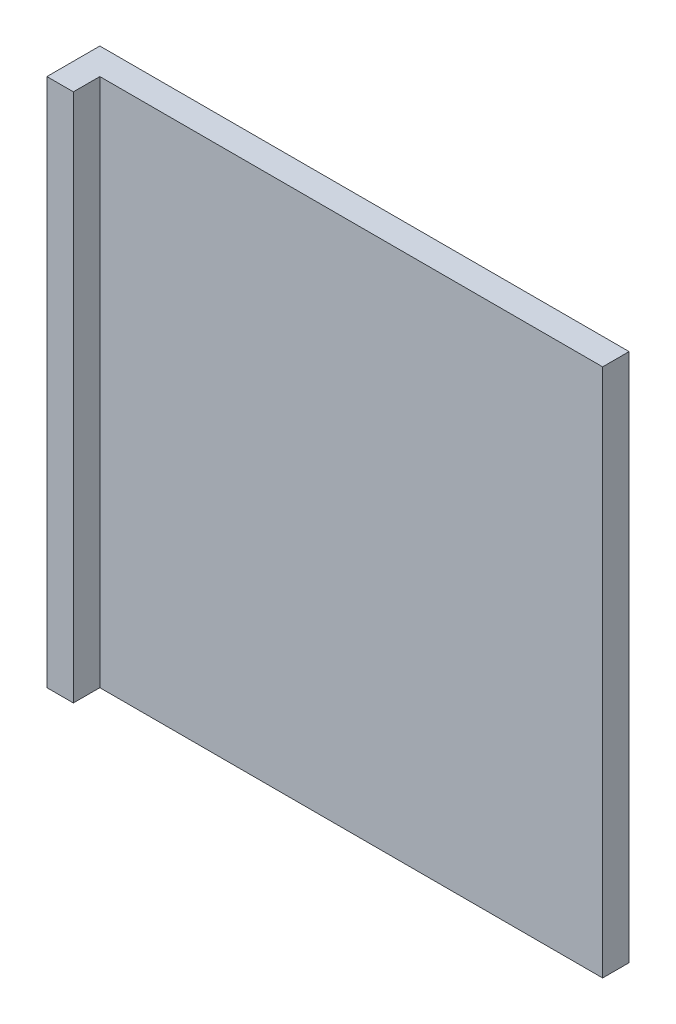
ISO-10303-21;
HEADER;
FILE_DESCRIPTION(('STEP AP214'),'2;1');
FILE_NAME('part.step','',(''),(''),'','','');
FILE_SCHEMA(('AUTOMOTIVE_DESIGN { 1 0 10303 214 1 1 1 1 }'));
ENDSEC;
DATA;
#1=APPLICATION_CONTEXT('core data for automotive mechanical design processes');
#2=APPLICATION_PROTOCOL_DEFINITION('international standard','automotive_design',2000,#1);
#3=PRODUCT_CONTEXT('',#1,'mechanical');
#4=PRODUCT('Part','Part','',(#3));
#5=PRODUCT_RELATED_PRODUCT_CATEGORY('part','',(#4));
#6=PRODUCT_DEFINITION_FORMATION('','',#4);
#7=PRODUCT_DEFINITION_CONTEXT('part definition',#1,'design');
#8=PRODUCT_DEFINITION('design','',#6,#7);
#9=PRODUCT_DEFINITION_SHAPE('','',#8);
#10=(LENGTH_UNIT() NAMED_UNIT(*) SI_UNIT(.MILLI.,.METRE.));
#11=(NAMED_UNIT(*) PLANE_ANGLE_UNIT() SI_UNIT($,.RADIAN.));
#12=(NAMED_UNIT(*) SI_UNIT($,.STERADIAN.) SOLID_ANGLE_UNIT());
#13=UNCERTAINTY_MEASURE_WITH_UNIT(LENGTH_MEASURE(1.E-05),#10,'distance_accuracy_value','');
#14=(GEOMETRIC_REPRESENTATION_CONTEXT(3) GLOBAL_UNCERTAINTY_ASSIGNED_CONTEXT((#13)) GLOBAL_UNIT_ASSIGNED_CONTEXT((#10,
#11,#12)) REPRESENTATION_CONTEXT('',''));
#15=CARTESIAN_POINT('',(0.,0.,0.));
#16=DIRECTION('',(0.,0.,1.));
#17=DIRECTION('',(1.,0.,0.));
#18=AXIS2_PLACEMENT_3D('',#15,#16,#17);
#19=CARTESIAN_POINT('',(0.,0.,20.));
#20=DIRECTION('',(0.,0.,-1.));
#21=DIRECTION('',(-1.,0.,0.));
#22=AXIS2_PLACEMENT_3D('',#19,#20,#21);
#23=PLANE('',#22);
#24=DIRECTION('',(0.,-1.,0.));
#25=VECTOR('',#24,1.);
#26=CARTESIAN_POINT('',(-90.0000000000008,99.9999999999999,20.));
#27=LINE('',#26,#25);
#28=CARTESIAN_POINT('',(-90.0000000000008,-99.9999999999999,20.));
#29=VERTEX_POINT('',#28);
#30=CARTESIAN_POINT('',(-90.0000000000008,99.9999999999999,20.));
#31=VERTEX_POINT('',#30);
#32=EDGE_CURVE('E20',#29,#31,#27,.F.);
#33=ORIENTED_EDGE('',*,*,#32,.T.);
#34=DIRECTION('',(1.,0.,0.));
#35=VECTOR('',#34,1.);
#36=CARTESIAN_POINT('',(-99.9999999999999,99.9999999999999,20.));
#37=LINE('',#36,#35);
#38=CARTESIAN_POINT('',(-100.000000000001,99.9999999999999,20.));
#39=VERTEX_POINT('',#38);
#40=EDGE_CURVE('E86',#31,#39,#37,.F.);
#41=ORIENTED_EDGE('',*,*,#40,.T.);
#42=DIRECTION('',(0.,1.,0.));
#43=VECTOR('',#42,1.);
#44=CARTESIAN_POINT('',(-99.9999999999999,99.9999999999999,20.));
#45=LINE('',#44,#43);
#46=CARTESIAN_POINT('',(-100.,-99.9999999999999,20.));
#47=VERTEX_POINT('',#46);
#48=EDGE_CURVE('E96',#39,#47,#45,.F.);
#49=ORIENTED_EDGE('',*,*,#48,.T.);
#50=DIRECTION('',(1.,0.,0.));
#51=VECTOR('',#50,1.);
#52=CARTESIAN_POINT('',(-100.,-99.9999999999999,20.));
#53=LINE('',#52,#51);
#54=EDGE_CURVE('E101',#47,#29,#53,.T.);
#55=ORIENTED_EDGE('',*,*,#54,.T.);
#56=EDGE_LOOP('',(#33,#41,#49,#55));
#57=FACE_BOUND('',#56,.T.);
#58=ADVANCED_FACE('F17',(#57),#23,.F.);
#59=CARTESIAN_POINT('',(-90.0000000000008,99.9999999999999,20.));
#60=DIRECTION('',(-1.,0.,0.));
#61=DIRECTION('',(0.,-1.,0.));
#62=AXIS2_PLACEMENT_3D('',#59,#60,#61);
#63=PLANE('',#62);
#64=DIRECTION('',(0.,0.,1.));
#65=VECTOR('',#64,1.);
#66=CARTESIAN_POINT('',(-90.0000000000008,99.9999999999999,10.));
#67=LINE('',#66,#65);
#68=CARTESIAN_POINT('',(-90.0000000000008,100.,10.));
#69=VERTEX_POINT('',#68);
#70=EDGE_CURVE('E74',#69,#31,#67,.T.);
#71=ORIENTED_EDGE('',*,*,#70,.T.);
#72=ORIENTED_EDGE('',*,*,#32,.F.);
#73=DIRECTION('',(0.,0.,1.));
#74=VECTOR('',#73,1.);
#75=CARTESIAN_POINT('',(-90.0000000000008,-99.9999999999999,10.));
#76=LINE('',#75,#74);
#77=CARTESIAN_POINT('',(-90.0000000000008,-99.9999999999999,10.));
#78=VERTEX_POINT('',#77);
#79=EDGE_CURVE('E76',#29,#78,#76,.F.);
#80=ORIENTED_EDGE('',*,*,#79,.T.);
#81=DIRECTION('',(0.,1.,0.));
#82=VECTOR('',#81,1.);
#83=CARTESIAN_POINT('',(-90.0000000000008,0.,10.));
#84=LINE('',#83,#82);
#85=EDGE_CURVE('E71',#69,#78,#84,.F.);
#86=ORIENTED_EDGE('',*,*,#85,.F.);
#87=EDGE_LOOP('',(#71,#72,#80,#86));
#88=FACE_BOUND('',#87,.T.);
#89=ADVANCED_FACE('F73',(#88),#63,.F.);
#90=CARTESIAN_POINT('',(0.,0.,10.));
#91=DIRECTION('',(0.,0.,1.));
#92=DIRECTION('',(1.,0.,0.));
#93=AXIS2_PLACEMENT_3D('',#90,#91,#92);
#94=PLANE('',#93);
#95=DIRECTION('',(0.,-1.,0.));
#96=VECTOR('',#95,1.);
#97=CARTESIAN_POINT('',(100.,100.,10.));
#98=LINE('',#97,#96);
#99=CARTESIAN_POINT('',(100.000000000001,-99.9999999999999,10.));
#100=VERTEX_POINT('',#99);
#101=CARTESIAN_POINT('',(100.000000000001,100.,10.));
#102=VERTEX_POINT('',#101);
#103=EDGE_CURVE('E90',#100,#102,#98,.F.);
#104=ORIENTED_EDGE('',*,*,#103,.T.);
#105=DIRECTION('',(1.,0.,0.));
#106=VECTOR('',#105,1.);
#107=CARTESIAN_POINT('',(-99.9999999999999,99.9999999999999,10.));
#108=LINE('',#107,#106);
#109=EDGE_CURVE('E80',#102,#69,#108,.F.);
#110=ORIENTED_EDGE('',*,*,#109,.T.);
#111=ORIENTED_EDGE('',*,*,#85,.T.);
#112=DIRECTION('',(1.,0.,0.));
#113=VECTOR('',#112,1.);
#114=CARTESIAN_POINT('',(-100.,-99.9999999999999,10.));
#115=LINE('',#114,#113);
#116=EDGE_CURVE('E104',#78,#100,#115,.T.);
#117=ORIENTED_EDGE('',*,*,#116,.T.);
#118=EDGE_LOOP('',(#104,#110,#111,#117));
#119=FACE_BOUND('',#118,.T.);
#120=ADVANCED_FACE('F89',(#119),#94,.T.);
#121=CARTESIAN_POINT('',(-99.9999999999999,99.9999999999999,10.));
#122=DIRECTION('',(0.,-1.,0.));
#123=DIRECTION('',(1.,0.,0.));
#124=AXIS2_PLACEMENT_3D('',#121,#122,#123);
#125=PLANE('',#124);
#126=DIRECTION('',(0.,0.,1.));
#127=VECTOR('',#126,1.);
#128=CARTESIAN_POINT('',(-99.9999999999999,99.9999999999999,10.));
#129=LINE('',#128,#127);
#130=CARTESIAN_POINT('',(-100.,99.9999999999999,0.));
#131=VERTEX_POINT('',#130);
#132=EDGE_CURVE('E94',#131,#39,#129,.T.);
#133=ORIENTED_EDGE('',*,*,#132,.T.);
#134=ORIENTED_EDGE('',*,*,#40,.F.);
#135=ORIENTED_EDGE('',*,*,#70,.F.);
#136=ORIENTED_EDGE('',*,*,#109,.F.);
#137=DIRECTION('',(0.,0.,1.));
#138=VECTOR('',#137,1.);
#139=CARTESIAN_POINT('',(100.,100.,10.));
#140=LINE('',#139,#138);
#141=CARTESIAN_POINT('',(100.,100.,0.));
#142=VERTEX_POINT('',#141);
#143=EDGE_CURVE('E108',#102,#142,#140,.F.);
#144=ORIENTED_EDGE('',*,*,#143,.T.);
#145=DIRECTION('',(1.,0.,0.));
#146=VECTOR('',#145,1.);
#147=CARTESIAN_POINT('',(0.,100.,0.));
#148=LINE('',#147,#146);
#149=EDGE_CURVE('E110',#142,#131,#148,.F.);
#150=ORIENTED_EDGE('',*,*,#149,.T.);
#151=EDGE_LOOP('',(#133,#134,#135,#136,#144,#150));
#152=FACE_BOUND('',#151,.T.);
#153=ADVANCED_FACE('F83',(#152),#125,.F.);
#154=CARTESIAN_POINT('',(-99.9999999999999,99.9999999999999,10.));
#155=DIRECTION('',(1.,0.,0.));
#156=DIRECTION('',(0.,1.,0.));
#157=AXIS2_PLACEMENT_3D('',#154,#155,#156);
#158=PLANE('',#157);
#159=DIRECTION('',(0.,0.,1.));
#160=VECTOR('',#159,1.);
#161=CARTESIAN_POINT('',(-100.,-99.9999999999999,10.));
#162=LINE('',#161,#160);
#163=CARTESIAN_POINT('',(-100.,-99.9999999999999,0.));
#164=VERTEX_POINT('',#163);
#165=EDGE_CURVE('E98',#164,#47,#162,.T.);
#166=ORIENTED_EDGE('',*,*,#165,.T.);
#167=ORIENTED_EDGE('',*,*,#48,.F.);
#168=ORIENTED_EDGE('',*,*,#132,.F.);
#169=DIRECTION('',(0.,1.,0.));
#170=VECTOR('',#169,1.);
#171=CARTESIAN_POINT('',(-99.9999999999999,0.,0.));
#172=LINE('',#171,#170);
#173=EDGE_CURVE('E113',#131,#164,#172,.F.);
#174=ORIENTED_EDGE('',*,*,#173,.T.);
#175=EDGE_LOOP('',(#166,#167,#168,#174));
#176=FACE_BOUND('',#175,.T.);
#177=ADVANCED_FACE('F125',(#176),#158,.F.);
#178=CARTESIAN_POINT('',(-100.,-99.9999999999999,10.));
#179=DIRECTION('',(0.,1.,0.));
#180=DIRECTION('',(0.,0.,1.));
#181=AXIS2_PLACEMENT_3D('',#178,#179,#180);
#182=PLANE('',#181);
#183=DIRECTION('',(0.,0.,1.));
#184=VECTOR('',#183,1.);
#185=CARTESIAN_POINT('',(100.000000000001,-99.9999999999999,10.));
#186=LINE('',#185,#184);
#187=CARTESIAN_POINT('',(100.000000000001,-99.9999999999999,0.));
#188=VERTEX_POINT('',#187);
#189=EDGE_CURVE('E34',#188,#100,#186,.T.);
#190=ORIENTED_EDGE('',*,*,#189,.T.);
#191=ORIENTED_EDGE('',*,*,#116,.F.);
#192=ORIENTED_EDGE('',*,*,#79,.F.);
#193=ORIENTED_EDGE('',*,*,#54,.F.);
#194=ORIENTED_EDGE('',*,*,#165,.F.);
#195=DIRECTION('',(1.,0.,0.));
#196=VECTOR('',#195,1.);
#197=CARTESIAN_POINT('',(0.,-99.9999999999999,0.));
#198=LINE('',#197,#196);
#199=EDGE_CURVE('E26',#164,#188,#198,.T.);
#200=ORIENTED_EDGE('',*,*,#199,.T.);
#201=EDGE_LOOP('',(#190,#191,#192,#193,#194,#200));
#202=FACE_BOUND('',#201,.T.);
#203=ADVANCED_FACE('F119',(#202),#182,.F.);
#204=CARTESIAN_POINT('',(100.,100.,10.));
#205=DIRECTION('',(-1.,0.,0.));
#206=DIRECTION('',(0.,-1.,0.));
#207=AXIS2_PLACEMENT_3D('',#204,#205,#206);
#208=PLANE('',#207);
#209=ORIENTED_EDGE('',*,*,#143,.F.);
#210=ORIENTED_EDGE('',*,*,#103,.F.);
#211=ORIENTED_EDGE('',*,*,#189,.F.);
#212=DIRECTION('',(0.,1.,0.));
#213=VECTOR('',#212,1.);
#214=CARTESIAN_POINT('',(100.000000000001,0.,0.));
#215=LINE('',#214,#213);
#216=EDGE_CURVE('E11',#188,#142,#215,.T.);
#217=ORIENTED_EDGE('',*,*,#216,.T.);
#218=EDGE_LOOP('',(#209,#210,#211,#217));
#219=FACE_BOUND('',#218,.T.);
#220=ADVANCED_FACE('F127',(#219),#208,.F.);
#221=CARTESIAN_POINT('',(0.,0.,0.));
#222=DIRECTION('',(0.,0.,1.));
#223=DIRECTION('',(1.,0.,0.));
#224=AXIS2_PLACEMENT_3D('',#221,#222,#223);
#225=PLANE('',#224);
#226=ORIENTED_EDGE('',*,*,#199,.F.);
#227=ORIENTED_EDGE('',*,*,#173,.F.);
#228=ORIENTED_EDGE('',*,*,#149,.F.);
#229=ORIENTED_EDGE('',*,*,#216,.F.);
#230=EDGE_LOOP('',(#226,#227,#228,#229));
#231=FACE_BOUND('',#230,.T.);
#232=ADVANCED_FACE('F123',(#231),#225,.F.);
#233=CLOSED_SHELL('',(#58,#89,#120,#153,#177,#203,#220,#232));
#234=MANIFOLD_SOLID_BREP('B1',#233);
#235=ADVANCED_BREP_SHAPE_REPRESENTATION('',(#18,#234),#14);
#236=SHAPE_DEFINITION_REPRESENTATION(#9,#235);
ENDSEC;
END-ISO-10303-21;
